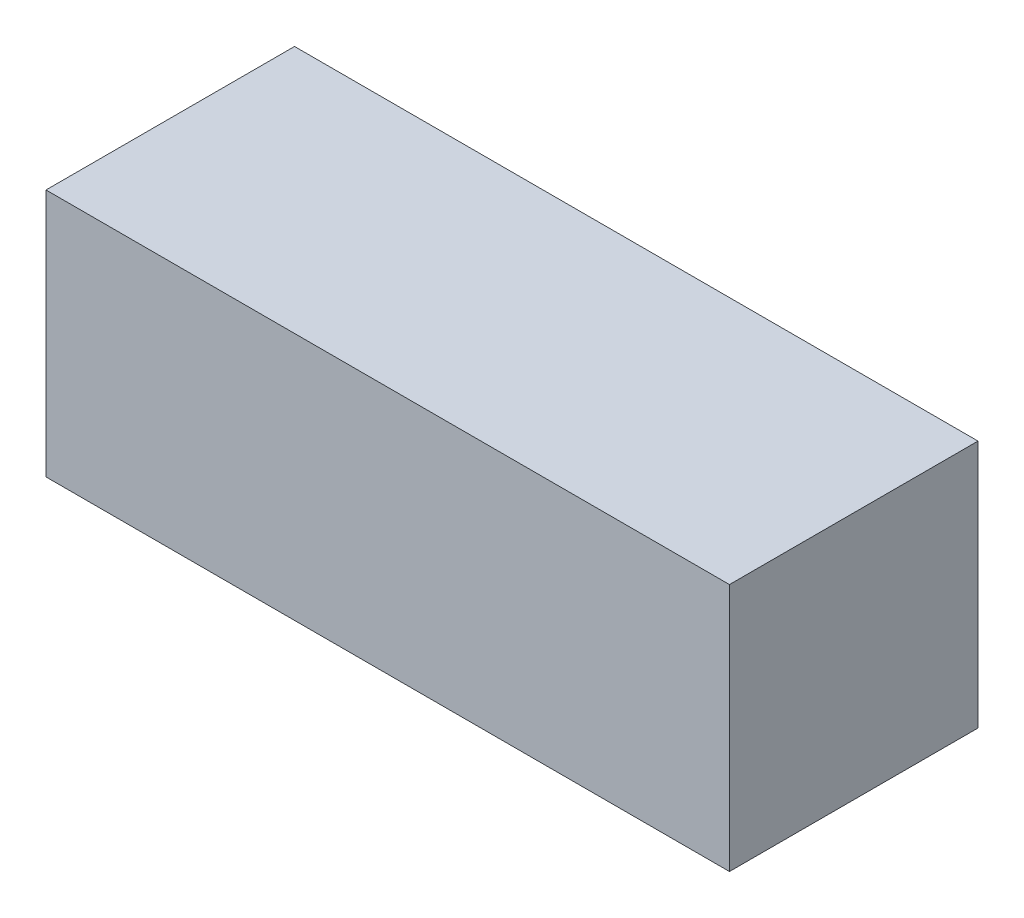
ISO-10303-21;
HEADER;
FILE_DESCRIPTION(('STEP AP214'),'2;1');
FILE_NAME('part.step','',(''),(''),'','','');
FILE_SCHEMA(('AUTOMOTIVE_DESIGN { 1 0 10303 214 1 1 1 1 }'));
ENDSEC;
DATA;
#1=APPLICATION_CONTEXT('core data for automotive mechanical design processes');
#2=APPLICATION_PROTOCOL_DEFINITION('international standard','automotive_design',2000,#1);
#3=PRODUCT_CONTEXT('',#1,'mechanical');
#4=PRODUCT('Part','Part','',(#3));
#5=PRODUCT_RELATED_PRODUCT_CATEGORY('part','',(#4));
#6=PRODUCT_DEFINITION_FORMATION('','',#4);
#7=PRODUCT_DEFINITION_CONTEXT('part definition',#1,'design');
#8=PRODUCT_DEFINITION('design','',#6,#7);
#9=PRODUCT_DEFINITION_SHAPE('','',#8);
#10=(LENGTH_UNIT() NAMED_UNIT(*) SI_UNIT(.MILLI.,.METRE.));
#11=(NAMED_UNIT(*) PLANE_ANGLE_UNIT() SI_UNIT($,.RADIAN.));
#12=(NAMED_UNIT(*) SI_UNIT($,.STERADIAN.) SOLID_ANGLE_UNIT());
#13=UNCERTAINTY_MEASURE_WITH_UNIT(LENGTH_MEASURE(1.E-05),#10,'distance_accuracy_value','');
#14=(GEOMETRIC_REPRESENTATION_CONTEXT(3) GLOBAL_UNCERTAINTY_ASSIGNED_CONTEXT((#13)) GLOBAL_UNIT_ASSIGNED_CONTEXT((#10,
#11,#12)) REPRESENTATION_CONTEXT('',''));
#15=CARTESIAN_POINT('',(0.,0.,0.));
#16=DIRECTION('',(0.,0.,1.));
#17=DIRECTION('',(1.,0.,0.));
#18=AXIS2_PLACEMENT_3D('',#15,#16,#17);
#19=CARTESIAN_POINT('',(0.,0.,2.));
#20=DIRECTION('',(0.,0.,1.));
#21=DIRECTION('',(1.,0.,0.));
#22=AXIS2_PLACEMENT_3D('',#19,#20,#21);
#23=PLANE('',#22);
#24=DIRECTION('',(-1.,0.,0.));
#25=VECTOR('',#24,1.);
#26=CARTESIAN_POINT('',(0.,-2.,2.));
#27=LINE('',#26,#25);
#28=CARTESIAN_POINT('',(5.5,-2.,2.));
#29=VERTEX_POINT('',#28);
#30=CARTESIAN_POINT('',(-5.5,-2.,2.));
#31=VERTEX_POINT('',#30);
#32=EDGE_CURVE('E10',#29,#31,#27,.T.);
#33=ORIENTED_EDGE('',*,*,#32,.F.);
#34=DIRECTION('',(0.,-1.,0.));
#35=VECTOR('',#34,1.);
#36=CARTESIAN_POINT('',(5.5,0.,2.));
#37=LINE('',#36,#35);
#38=CARTESIAN_POINT('',(5.5,2.,2.));
#39=VERTEX_POINT('',#38);
#40=EDGE_CURVE('E58',#39,#29,#37,.T.);
#41=ORIENTED_EDGE('',*,*,#40,.F.);
#42=DIRECTION('',(1.,0.,0.));
#43=VECTOR('',#42,1.);
#44=CARTESIAN_POINT('',(0.,2.,2.));
#45=LINE('',#44,#43);
#46=CARTESIAN_POINT('',(-5.5,2.,2.));
#47=VERTEX_POINT('',#46);
#48=EDGE_CURVE('E88',#47,#39,#45,.T.);
#49=ORIENTED_EDGE('',*,*,#48,.F.);
#50=DIRECTION('',(0.,1.,0.));
#51=VECTOR('',#50,1.);
#52=CARTESIAN_POINT('',(-5.5,0.,2.));
#53=LINE('',#52,#51);
#54=EDGE_CURVE('E23',#31,#47,#53,.T.);
#55=ORIENTED_EDGE('',*,*,#54,.F.);
#56=EDGE_LOOP('',(#33,#41,#49,#55));
#57=FACE_BOUND('',#56,.T.);
#58=ADVANCED_FACE('F16',(#57),#23,.T.);
#59=CARTESIAN_POINT('',(0.,-2.,-2.));
#60=DIRECTION('',(0.,-1.,0.));
#61=DIRECTION('',(0.,0.,-1.));
#62=AXIS2_PLACEMENT_3D('',#59,#60,#61);
#63=PLANE('',#62);
#64=DIRECTION('',(0.,0.,1.));
#65=VECTOR('',#64,1.);
#66=CARTESIAN_POINT('',(5.5,-2.,-2.));
#67=LINE('',#66,#65);
#68=CARTESIAN_POINT('',(5.5,-2.,-2.));
#69=VERTEX_POINT('',#68);
#70=EDGE_CURVE('E52',#69,#29,#67,.T.);
#71=ORIENTED_EDGE('',*,*,#70,.T.);
#72=ORIENTED_EDGE('',*,*,#32,.T.);
#73=DIRECTION('',(0.,0.,1.));
#74=VECTOR('',#73,1.);
#75=CARTESIAN_POINT('',(-5.5,-2.,-2.));
#76=LINE('',#75,#74);
#77=CARTESIAN_POINT('',(-5.5,-2.,-2.));
#78=VERTEX_POINT('',#77);
#79=EDGE_CURVE('E66',#78,#31,#76,.T.);
#80=ORIENTED_EDGE('',*,*,#79,.F.);
#81=DIRECTION('',(1.,0.,0.));
#82=VECTOR('',#81,1.);
#83=CARTESIAN_POINT('',(0.,-2.,-2.));
#84=LINE('',#83,#82);
#85=EDGE_CURVE('E63',#78,#69,#84,.T.);
#86=ORIENTED_EDGE('',*,*,#85,.T.);
#87=EDGE_LOOP('',(#71,#72,#80,#86));
#88=FACE_BOUND('',#87,.T.);
#89=ADVANCED_FACE('F65',(#88),#63,.T.);
#90=CARTESIAN_POINT('',(-5.5,0.,-2.));
#91=DIRECTION('',(-1.,0.,0.));
#92=DIRECTION('',(0.,0.,1.));
#93=AXIS2_PLACEMENT_3D('',#90,#91,#92);
#94=PLANE('',#93);
#95=ORIENTED_EDGE('',*,*,#79,.T.);
#96=ORIENTED_EDGE('',*,*,#54,.T.);
#97=DIRECTION('',(0.,0.,1.));
#98=VECTOR('',#97,1.);
#99=CARTESIAN_POINT('',(-5.5,2.,-2.));
#100=LINE('',#99,#98);
#101=CARTESIAN_POINT('',(-5.5,2.,-2.));
#102=VERTEX_POINT('',#101);
#103=EDGE_CURVE('E81',#102,#47,#100,.T.);
#104=ORIENTED_EDGE('',*,*,#103,.F.);
#105=DIRECTION('',(0.,-1.,0.));
#106=VECTOR('',#105,1.);
#107=CARTESIAN_POINT('',(-5.5,0.,-2.));
#108=LINE('',#107,#106);
#109=EDGE_CURVE('E69',#102,#78,#108,.T.);
#110=ORIENTED_EDGE('',*,*,#109,.T.);
#111=EDGE_LOOP('',(#95,#96,#104,#110));
#112=FACE_BOUND('',#111,.T.);
#113=ADVANCED_FACE('F89',(#112),#94,.T.);
#114=CARTESIAN_POINT('',(0.,2.,-2.));
#115=DIRECTION('',(0.,1.,0.));
#116=DIRECTION('',(0.,0.,1.));
#117=AXIS2_PLACEMENT_3D('',#114,#115,#116);
#118=PLANE('',#117);
#119=ORIENTED_EDGE('',*,*,#103,.T.);
#120=ORIENTED_EDGE('',*,*,#48,.T.);
#121=DIRECTION('',(0.,0.,1.));
#122=VECTOR('',#121,1.);
#123=CARTESIAN_POINT('',(5.5,2.,-2.));
#124=LINE('',#123,#122);
#125=CARTESIAN_POINT('',(5.5,2.,-2.));
#126=VERTEX_POINT('',#125);
#127=EDGE_CURVE('E61',#126,#39,#124,.T.);
#128=ORIENTED_EDGE('',*,*,#127,.F.);
#129=DIRECTION('',(-1.,0.,0.));
#130=VECTOR('',#129,1.);
#131=CARTESIAN_POINT('',(0.,2.,-2.));
#132=LINE('',#131,#130);
#133=EDGE_CURVE('E74',#126,#102,#132,.T.);
#134=ORIENTED_EDGE('',*,*,#133,.T.);
#135=EDGE_LOOP('',(#119,#120,#128,#134));
#136=FACE_BOUND('',#135,.T.);
#137=ADVANCED_FACE('F86',(#136),#118,.T.);
#138=CARTESIAN_POINT('',(0.,0.,-2.));
#139=DIRECTION('',(0.,0.,-1.));
#140=DIRECTION('',(-1.,0.,0.));
#141=AXIS2_PLACEMENT_3D('',#138,#139,#140);
#142=PLANE('',#141);
#143=DIRECTION('',(0.,1.,0.));
#144=VECTOR('',#143,1.);
#145=CARTESIAN_POINT('',(5.5,0.,-2.));
#146=LINE('',#145,#144);
#147=EDGE_CURVE('E59',#69,#126,#146,.T.);
#148=ORIENTED_EDGE('',*,*,#147,.F.);
#149=ORIENTED_EDGE('',*,*,#85,.F.);
#150=ORIENTED_EDGE('',*,*,#109,.F.);
#151=ORIENTED_EDGE('',*,*,#133,.F.);
#152=EDGE_LOOP('',(#148,#149,#150,#151));
#153=FACE_BOUND('',#152,.T.);
#154=ADVANCED_FACE('F73',(#153),#142,.T.);
#155=CARTESIAN_POINT('',(5.5,0.,-2.));
#156=DIRECTION('',(1.,0.,0.));
#157=DIRECTION('',(0.,0.,-1.));
#158=AXIS2_PLACEMENT_3D('',#155,#156,#157);
#159=PLANE('',#158);
#160=ORIENTED_EDGE('',*,*,#147,.T.);
#161=ORIENTED_EDGE('',*,*,#127,.T.);
#162=ORIENTED_EDGE('',*,*,#40,.T.);
#163=ORIENTED_EDGE('',*,*,#70,.F.);
#164=EDGE_LOOP('',(#160,#161,#162,#163));
#165=FACE_BOUND('',#164,.T.);
#166=ADVANCED_FACE('F54',(#165),#159,.T.);
#167=CLOSED_SHELL('',(#58,#89,#113,#137,#154,#166));
#168=MANIFOLD_SOLID_BREP('B1',#167);
#169=ADVANCED_BREP_SHAPE_REPRESENTATION('',(#18,#168),#14);
#170=SHAPE_DEFINITION_REPRESENTATION(#9,#169);
ENDSEC;
END-ISO-10303-21;
